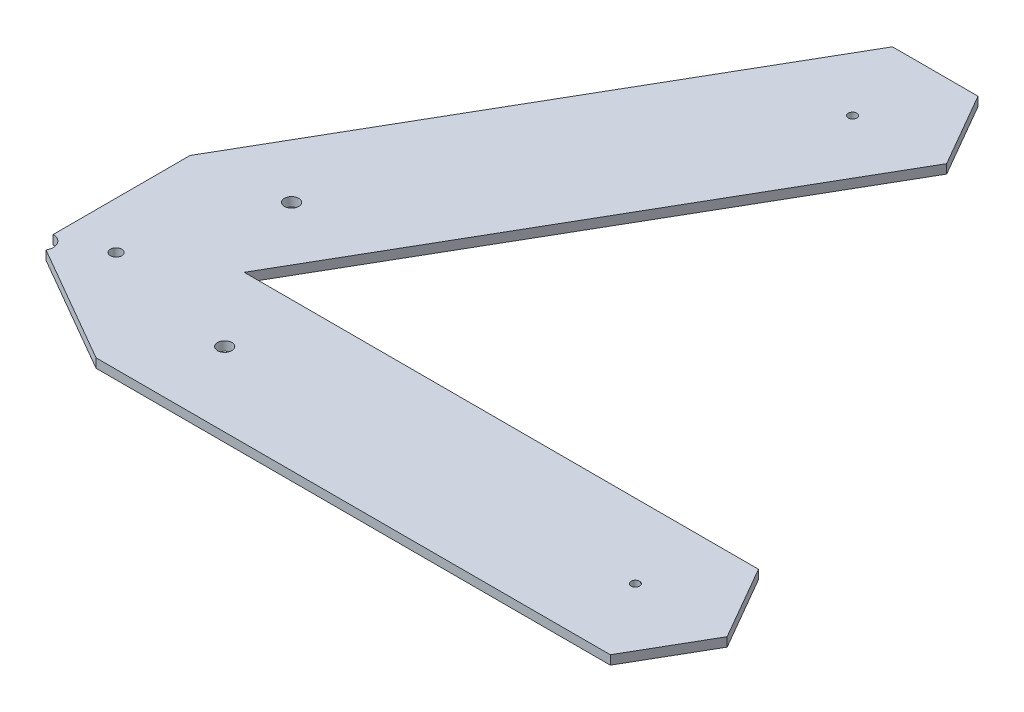
ISO-10303-21;
HEADER;
FILE_DESCRIPTION(('STEP AP214'),'2;1');
FILE_NAME('part.step','',(''),(''),'','','');
FILE_SCHEMA(('AUTOMOTIVE_DESIGN { 1 0 10303 214 1 1 1 1 }'));
ENDSEC;
DATA;
#1=APPLICATION_CONTEXT('core data for automotive mechanical design processes');
#2=APPLICATION_PROTOCOL_DEFINITION('international standard','automotive_design',2000,#1);
#3=PRODUCT_CONTEXT('',#1,'mechanical');
#4=PRODUCT('Part','Part','',(#3));
#5=PRODUCT_RELATED_PRODUCT_CATEGORY('part','',(#4));
#6=PRODUCT_DEFINITION_FORMATION('','',#4);
#7=PRODUCT_DEFINITION_CONTEXT('part definition',#1,'design');
#8=PRODUCT_DEFINITION('design','',#6,#7);
#9=PRODUCT_DEFINITION_SHAPE('','',#8);
#10=(LENGTH_UNIT() NAMED_UNIT(*) SI_UNIT(.MILLI.,.METRE.));
#11=(NAMED_UNIT(*) PLANE_ANGLE_UNIT() SI_UNIT($,.RADIAN.));
#12=(NAMED_UNIT(*) SI_UNIT($,.STERADIAN.) SOLID_ANGLE_UNIT());
#13=UNCERTAINTY_MEASURE_WITH_UNIT(LENGTH_MEASURE(1.E-05),#10,'distance_accuracy_value','');
#14=(GEOMETRIC_REPRESENTATION_CONTEXT(3) GLOBAL_UNCERTAINTY_ASSIGNED_CONTEXT((#13)) GLOBAL_UNIT_ASSIGNED_CONTEXT((#10,
#11,#12)) REPRESENTATION_CONTEXT('',''));
#15=CARTESIAN_POINT('',(0.,0.,0.));
#16=DIRECTION('',(0.,0.,1.));
#17=DIRECTION('',(1.,0.,0.));
#18=AXIS2_PLACEMENT_3D('',#15,#16,#17);
#19=CARTESIAN_POINT('',(0.,3.175,0.));
#20=DIRECTION('',(0.,-1.,0.));
#21=DIRECTION('',(0.,0.,-1.));
#22=AXIS2_PLACEMENT_3D('',#19,#20,#21);
#23=CYLINDRICAL_SURFACE('',#22,3.96875);
#24=CARTESIAN_POINT('',(0.,0.,0.));
#25=DIRECTION('',(0.,1.,0.));
#26=DIRECTION('',(0.,0.,1.));
#27=AXIS2_PLACEMENT_3D('',#24,#25,#26);
#28=CIRCLE('',#27,3.96875);
#29=CARTESIAN_POINT('',(3.43703832126949,0.,1.984375));
#30=VERTEX_POINT('',#29);
#31=CARTESIAN_POINT('',(0.,0.,-3.96875));
#32=VERTEX_POINT('',#31);
#33=EDGE_CURVE('E191',#30,#32,#28,.T.);
#34=ORIENTED_EDGE('',*,*,#33,.F.);
#35=DIRECTION('',(0.,1.,0.));
#36=VECTOR('',#35,1.);
#37=CARTESIAN_POINT('',(3.43703832126949,0.,1.984375));
#38=LINE('',#37,#36);
#39=CARTESIAN_POINT('',(3.43703832126949,3.175,1.984375));
#40=VERTEX_POINT('',#39);
#41=EDGE_CURVE('E50',#30,#40,#38,.T.);
#42=ORIENTED_EDGE('',*,*,#41,.T.);
#43=CARTESIAN_POINT('',(0.,3.175,0.));
#44=DIRECTION('',(0.,1.,0.));
#45=DIRECTION('',(0.,0.,1.));
#46=AXIS2_PLACEMENT_3D('',#43,#44,#45);
#47=CIRCLE('',#46,3.96875);
#48=CARTESIAN_POINT('',(0.,3.175,-3.96875));
#49=VERTEX_POINT('',#48);
#50=EDGE_CURVE('E151',#40,#49,#47,.T.);
#51=ORIENTED_EDGE('',*,*,#50,.T.);
#52=DIRECTION('',(0.,1.,0.));
#53=VECTOR('',#52,1.);
#54=CARTESIAN_POINT('',(0.,0.,-3.96875));
#55=LINE('',#54,#53);
#56=EDGE_CURVE('E167',#32,#49,#55,.T.);
#57=ORIENTED_EDGE('',*,*,#56,.F.);
#58=EDGE_LOOP('',(#34,#42,#51,#57));
#59=FACE_BOUND('',#58,.T.);
#60=ADVANCED_FACE('F35',(#59),#23,.F.);
#61=CARTESIAN_POINT('',(0.,3.175,0.));
#62=DIRECTION('',(0.,1.,0.));
#63=DIRECTION('',(0.,0.,1.));
#64=AXIS2_PLACEMENT_3D('',#61,#62,#63);
#65=PLANE('',#64);
#66=CARTESIAN_POINT('',(104.091105000002,3.175,-180.291082475986));
#67=DIRECTION('',(0.,1.,0.));
#68=DIRECTION('',(0.,0.,1.));
#69=AXIS2_PLACEMENT_3D('',#66,#67,#68);
#70=CIRCLE('',#69,1.49999999999998);
#71=CARTESIAN_POINT('',(104.091105000002,3.175,-178.791082475986));
#72=VERTEX_POINT('',#71);
#73=EDGE_CURVE('E160',#72,#72,#70,.T.);
#74=ORIENTED_EDGE('',*,*,#73,.F.);
#75=EDGE_LOOP('',(#74));
#76=FACE_BOUND('',#75,.T.);
#77=CARTESIAN_POINT('',(32.066865,3.175,-55.5414394194522));
#78=DIRECTION('',(0.,1.,0.));
#79=DIRECTION('',(0.,0.,1.));
#80=AXIS2_PLACEMENT_3D('',#77,#78,#79);
#81=CIRCLE('',#80,2.5);
#82=CARTESIAN_POINT('',(32.066865,3.175,-53.0414394194522));
#83=VERTEX_POINT('',#82);
#84=EDGE_CURVE('E157',#83,#83,#81,.T.);
#85=ORIENTED_EDGE('',*,*,#84,.F.);
#86=EDGE_LOOP('',(#85));
#87=FACE_BOUND('',#86,.T.);
#88=CARTESIAN_POINT('',(16.4977839420935,3.175,-9.52500000000003));
#89=DIRECTION('',(0.,1.,0.));
#90=DIRECTION('',(0.,0.,1.));
#91=AXIS2_PLACEMENT_3D('',#88,#89,#90);
#92=CIRCLE('',#91,2.);
#93=CARTESIAN_POINT('',(16.4977839420935,3.175,-7.52500000000002));
#94=VERTEX_POINT('',#93);
#95=EDGE_CURVE('E154',#94,#94,#92,.T.);
#96=ORIENTED_EDGE('',*,*,#95,.F.);
#97=EDGE_LOOP('',(#96));
#98=FACE_BOUND('',#97,.T.);
#99=CARTESIAN_POINT('',(208.18221,3.175,0.));
#100=DIRECTION('',(0.,1.,0.));
#101=DIRECTION('',(0.,0.,1.));
#102=AXIS2_PLACEMENT_3D('',#99,#100,#101);
#103=CIRCLE('',#102,1.5);
#104=CARTESIAN_POINT('',(208.18221,3.175,1.5));
#105=VERTEX_POINT('',#104);
#106=EDGE_CURVE('E148',#105,#105,#103,.T.);
#107=ORIENTED_EDGE('',*,*,#106,.F.);
#108=EDGE_LOOP('',(#107));
#109=FACE_BOUND('',#108,.T.);
#110=CARTESIAN_POINT('',(64.13373,3.175,0.));
#111=DIRECTION('',(0.,1.,0.));
#112=DIRECTION('',(0.,0.,1.));
#113=AXIS2_PLACEMENT_3D('',#110,#111,#112);
#114=CIRCLE('',#113,2.5);
#115=CARTESIAN_POINT('',(64.13373,3.175,2.49999999999997));
#116=VERTEX_POINT('',#115);
#117=EDGE_CURVE('E145',#116,#116,#114,.T.);
#118=ORIENTED_EDGE('',*,*,#117,.F.);
#119=EDGE_LOOP('',(#118));
#120=FACE_BOUND('',#119,.T.);
#121=ORIENTED_EDGE('',*,*,#50,.F.);
#122=DIRECTION('',(0.866025403784438,0.,0.500000000000001));
#123=VECTOR('',#122,1.);
#124=CARTESIAN_POINT('',(0.,3.175,0.));
#125=LINE('',#124,#123);
#126=CARTESIAN_POINT('',(44.9999999999999,3.175,25.9807621135331));
#127=VERTEX_POINT('',#126);
#128=EDGE_CURVE('E253',#40,#127,#125,.T.);
#129=ORIENTED_EDGE('',*,*,#128,.T.);
#130=DIRECTION('',(-1.,0.,0.));
#131=VECTOR('',#130,1.);
#132=CARTESIAN_POINT('',(0.,3.175,25.9807621135331));
#133=LINE('',#132,#131);
#134=CARTESIAN_POINT('',(225.38814,3.175,25.9807621135332));
#135=VERTEX_POINT('',#134);
#136=EDGE_CURVE('E203',#135,#127,#133,.T.);
#137=ORIENTED_EDGE('',*,*,#136,.F.);
#138=DIRECTION('',(-0.499999999999997,0.,0.866025403784441));
#139=VECTOR('',#138,1.);
#140=CARTESIAN_POINT('',(180.291105000001,3.175,104.091118004245));
#141=LINE('',#140,#139);
#142=CARTESIAN_POINT('',(240.38814,3.175,0.));
#143=VERTEX_POINT('',#142);
#144=EDGE_CURVE('E217',#143,#135,#141,.T.);
#145=ORIENTED_EDGE('',*,*,#144,.F.);
#146=DIRECTION('',(-0.499999999999996,0.,-0.866025403784441));
#147=VECTOR('',#146,1.);
#148=CARTESIAN_POINT('',(180.291105000001,3.175,-104.091118004245));
#149=LINE('',#148,#147);
#150=CARTESIAN_POINT('',(225.38814,3.175,-25.9807621135332));
#151=VERTEX_POINT('',#150);
#152=EDGE_CURVE('E227',#143,#151,#149,.T.);
#153=ORIENTED_EDGE('',*,*,#152,.T.);
#154=DIRECTION('',(1.,0.,0.));
#155=VECTOR('',#154,1.);
#156=CARTESIAN_POINT('',(0.,3.175,-25.9807621135332));
#157=LINE('',#156,#155);
#158=CARTESIAN_POINT('',(44.9999999999998,3.175,-25.9807621135332));
#159=VERTEX_POINT('',#158);
#160=EDGE_CURVE('E135',#159,#151,#157,.T.);
#161=ORIENTED_EDGE('',*,*,#160,.F.);
#162=DIRECTION('',(-0.500000000000014,0.,0.866025403784431));
#163=VECTOR('',#162,1.);
#164=CARTESIAN_POINT('',(22.4999999999991,3.175,12.9903810567665));
#165=LINE('',#164,#163);
#166=CARTESIAN_POINT('',(135.194070000002,3.175,-182.201473894956));
#167=VERTEX_POINT('',#166);
#168=EDGE_CURVE('E120',#167,#159,#165,.T.);
#169=ORIENTED_EDGE('',*,*,#168,.F.);
#170=DIRECTION('',(0.499999999999994,0.,0.866025403784442));
#171=VECTOR('',#170,1.);
#172=CARTESIAN_POINT('',(180.291105000001,3.175,-104.091118004244));
#173=LINE('',#172,#171);
#174=CARTESIAN_POINT('',(120.194070000002,3.175,-208.182236008489));
#175=VERTEX_POINT('',#174);
#176=EDGE_CURVE('E133',#175,#167,#173,.T.);
#177=ORIENTED_EDGE('',*,*,#176,.F.);
#178=DIRECTION('',(-1.,0.,0.));
#179=VECTOR('',#178,1.);
#180=CARTESIAN_POINT('',(3.081716156461E-12,3.175,-208.182236008491));
#181=LINE('',#180,#179);
#182=CARTESIAN_POINT('',(90.1940700000024,3.175,-208.182236008489));
#183=VERTEX_POINT('',#182);
#184=EDGE_CURVE('E59',#175,#183,#181,.T.);
#185=ORIENTED_EDGE('',*,*,#184,.T.);
#186=DIRECTION('',(0.50000000000001,0.,-0.866025403784433));
#187=VECTOR('',#186,1.);
#188=CARTESIAN_POINT('',(-22.4999999999999,3.175,-12.9903810567669));
#189=LINE('',#188,#187);
#190=CARTESIAN_POINT('',(-1.25800873561094E-13,3.175,-51.9615242270673));
#191=VERTEX_POINT('',#190);
#192=EDGE_CURVE('E139',#191,#183,#189,.T.);
#193=ORIENTED_EDGE('',*,*,#192,.F.);
#194=DIRECTION('',(0.,0.,-1.));
#195=VECTOR('',#194,1.);
#196=CARTESIAN_POINT('',(0.,3.175,0.));
#197=LINE('',#196,#195);
#198=EDGE_CURVE('E244',#49,#191,#197,.T.);
#199=ORIENTED_EDGE('',*,*,#198,.F.);
#200=EDGE_LOOP('',(#121,#129,#137,#145,#153,#161,#169,#177,#185,#193,#199));
#201=FACE_BOUND('',#200,.T.);
#202=ADVANCED_FACE('F132',(#76,#87,#98,#109,#120,#201),#65,.T.);
#203=CARTESIAN_POINT('',(0.,0.,0.));
#204=DIRECTION('',(0.,1.,0.));
#205=DIRECTION('',(0.,0.,1.));
#206=AXIS2_PLACEMENT_3D('',#203,#204,#205);
#207=PLANE('',#206);
#208=CARTESIAN_POINT('',(104.091105000002,0.,-180.291082475986));
#209=DIRECTION('',(0.,1.,0.));
#210=DIRECTION('',(0.,0.,1.));
#211=AXIS2_PLACEMENT_3D('',#208,#209,#210);
#212=CIRCLE('',#211,1.49999999999998);
#213=CARTESIAN_POINT('',(104.091105000002,0.,-178.791082475986));
#214=VERTEX_POINT('',#213);
#215=EDGE_CURVE('E200',#214,#214,#212,.T.);
#216=ORIENTED_EDGE('',*,*,#215,.T.);
#217=EDGE_LOOP('',(#216));
#218=FACE_BOUND('',#217,.T.);
#219=CARTESIAN_POINT('',(32.066865,0.,-55.5414394194522));
#220=DIRECTION('',(0.,1.,0.));
#221=DIRECTION('',(0.,0.,1.));
#222=AXIS2_PLACEMENT_3D('',#219,#220,#221);
#223=CIRCLE('',#222,2.5);
#224=CARTESIAN_POINT('',(32.066865,0.,-53.0414394194522));
#225=VERTEX_POINT('',#224);
#226=EDGE_CURVE('E197',#225,#225,#223,.T.);
#227=ORIENTED_EDGE('',*,*,#226,.T.);
#228=EDGE_LOOP('',(#227));
#229=FACE_BOUND('',#228,.T.);
#230=CARTESIAN_POINT('',(16.4977839420935,0.,-9.52500000000003));
#231=DIRECTION('',(0.,1.,0.));
#232=DIRECTION('',(0.,0.,1.));
#233=AXIS2_PLACEMENT_3D('',#230,#231,#232);
#234=CIRCLE('',#233,2.);
#235=CARTESIAN_POINT('',(16.4977839420935,0.,-7.52500000000002));
#236=VERTEX_POINT('',#235);
#237=EDGE_CURVE('E194',#236,#236,#234,.T.);
#238=ORIENTED_EDGE('',*,*,#237,.T.);
#239=EDGE_LOOP('',(#238));
#240=FACE_BOUND('',#239,.T.);
#241=CARTESIAN_POINT('',(208.18221,0.,0.));
#242=DIRECTION('',(0.,1.,0.));
#243=DIRECTION('',(0.,0.,1.));
#244=AXIS2_PLACEMENT_3D('',#241,#242,#243);
#245=CIRCLE('',#244,1.5);
#246=CARTESIAN_POINT('',(208.18221,0.,1.5));
#247=VERTEX_POINT('',#246);
#248=EDGE_CURVE('E188',#247,#247,#245,.T.);
#249=ORIENTED_EDGE('',*,*,#248,.T.);
#250=EDGE_LOOP('',(#249));
#251=FACE_BOUND('',#250,.T.);
#252=CARTESIAN_POINT('',(64.13373,0.,0.));
#253=DIRECTION('',(0.,1.,0.));
#254=DIRECTION('',(0.,0.,1.));
#255=AXIS2_PLACEMENT_3D('',#252,#253,#254);
#256=CIRCLE('',#255,2.5);
#257=CARTESIAN_POINT('',(64.13373,0.,2.49999999999997));
#258=VERTEX_POINT('',#257);
#259=EDGE_CURVE('E185',#258,#258,#256,.T.);
#260=ORIENTED_EDGE('',*,*,#259,.T.);
#261=EDGE_LOOP('',(#260));
#262=FACE_BOUND('',#261,.T.);
#263=DIRECTION('',(0.866025403784438,0.,0.500000000000001));
#264=VECTOR('',#263,1.);
#265=CARTESIAN_POINT('',(0.,0.,0.));
#266=LINE('',#265,#264);
#267=CARTESIAN_POINT('',(44.9999999999999,0.,25.9807621135332));
#268=VERTEX_POINT('',#267);
#269=EDGE_CURVE('E261',#30,#268,#266,.T.);
#270=ORIENTED_EDGE('',*,*,#269,.F.);
#271=ORIENTED_EDGE('',*,*,#33,.T.);
#272=DIRECTION('',(0.,0.,-1.));
#273=VECTOR('',#272,1.);
#274=CARTESIAN_POINT('',(0.,0.,0.));
#275=LINE('',#274,#273);
#276=CARTESIAN_POINT('',(5.13478148889135E-13,0.,-51.9615242270662));
#277=VERTEX_POINT('',#276);
#278=EDGE_CURVE('E259',#32,#277,#275,.T.);
#279=ORIENTED_EDGE('',*,*,#278,.T.);
#280=DIRECTION('',(0.50000000000001,0.,-0.866025403784433));
#281=VECTOR('',#280,1.);
#282=CARTESIAN_POINT('',(-22.4999999999999,0.,-12.9903810567669));
#283=LINE('',#282,#281);
#284=CARTESIAN_POINT('',(90.1940700000024,0.,-208.182236008489));
#285=VERTEX_POINT('',#284);
#286=EDGE_CURVE('E182',#277,#285,#283,.T.);
#287=ORIENTED_EDGE('',*,*,#286,.T.);
#288=DIRECTION('',(-1.,0.,0.));
#289=VECTOR('',#288,1.);
#290=CARTESIAN_POINT('',(3.081716156461E-12,0.,-208.182236008491));
#291=LINE('',#290,#289);
#292=CARTESIAN_POINT('',(120.194070000002,0.,-208.182236008489));
#293=VERTEX_POINT('',#292);
#294=EDGE_CURVE('E179',#293,#285,#291,.T.);
#295=ORIENTED_EDGE('',*,*,#294,.F.);
#296=DIRECTION('',(0.499999999999994,0.,0.866025403784442));
#297=VECTOR('',#296,1.);
#298=CARTESIAN_POINT('',(180.291105000001,0.,-104.091118004244));
#299=LINE('',#298,#297);
#300=CARTESIAN_POINT('',(135.194070000002,0.,-182.201473894956));
#301=VERTEX_POINT('',#300);
#302=EDGE_CURVE('E177',#293,#301,#299,.T.);
#303=ORIENTED_EDGE('',*,*,#302,.T.);
#304=DIRECTION('',(-0.500000000000014,0.,0.866025403784431));
#305=VECTOR('',#304,1.);
#306=CARTESIAN_POINT('',(22.4999999999991,0.,12.9903810567665));
#307=LINE('',#306,#305);
#308=CARTESIAN_POINT('',(44.9999999999998,0.,-25.9807621135332));
#309=VERTEX_POINT('',#308);
#310=EDGE_CURVE('E122',#301,#309,#307,.T.);
#311=ORIENTED_EDGE('',*,*,#310,.T.);
#312=DIRECTION('',(1.,0.,0.));
#313=VECTOR('',#312,1.);
#314=CARTESIAN_POINT('',(0.,0.,-25.9807621135332));
#315=LINE('',#314,#313);
#316=CARTESIAN_POINT('',(225.38814,0.,-25.9807621135332));
#317=VERTEX_POINT('',#316);
#318=EDGE_CURVE('E173',#309,#317,#315,.T.);
#319=ORIENTED_EDGE('',*,*,#318,.T.);
#320=DIRECTION('',(-0.499999999999996,0.,-0.866025403784441));
#321=VECTOR('',#320,1.);
#322=CARTESIAN_POINT('',(180.291105000001,0.,-104.091118004245));
#323=LINE('',#322,#321);
#324=CARTESIAN_POINT('',(240.38814,0.,0.));
#325=VERTEX_POINT('',#324);
#326=EDGE_CURVE('E170',#325,#317,#323,.T.);
#327=ORIENTED_EDGE('',*,*,#326,.F.);
#328=DIRECTION('',(-0.499999999999997,0.,0.866025403784441));
#329=VECTOR('',#328,1.);
#330=CARTESIAN_POINT('',(180.291105000001,0.,104.091118004245));
#331=LINE('',#330,#329);
#332=CARTESIAN_POINT('',(225.38814,0.,25.9807621135332));
#333=VERTEX_POINT('',#332);
#334=EDGE_CURVE('E166',#325,#333,#331,.T.);
#335=ORIENTED_EDGE('',*,*,#334,.T.);
#336=DIRECTION('',(-1.,0.,0.));
#337=VECTOR('',#336,1.);
#338=CARTESIAN_POINT('',(0.,0.,25.9807621135331));
#339=LINE('',#338,#337);
#340=EDGE_CURVE('E163',#333,#268,#339,.T.);
#341=ORIENTED_EDGE('',*,*,#340,.T.);
#342=EDGE_LOOP('',(#270,#271,#279,#287,#295,#303,#311,#319,#327,#335,#341));
#343=FACE_BOUND('',#342,.T.);
#344=ADVANCED_FACE('F221',(#218,#229,#240,#251,#262,#343),#207,.F.);
#345=CARTESIAN_POINT('',(0.,3.175,25.9807621135331));
#346=DIRECTION('',(0.,0.,1.));
#347=DIRECTION('',(1.,0.,0.));
#348=AXIS2_PLACEMENT_3D('',#345,#346,#347);
#349=PLANE('',#348);
#350=ORIENTED_EDGE('',*,*,#340,.F.);
#351=DIRECTION('',(0.,-1.,0.));
#352=VECTOR('',#351,1.);
#353=CARTESIAN_POINT('',(225.38814,3.175,25.9807621135332));
#354=LINE('',#353,#352);
#355=EDGE_CURVE('E43',#135,#333,#354,.T.);
#356=ORIENTED_EDGE('',*,*,#355,.F.);
#357=ORIENTED_EDGE('',*,*,#136,.T.);
#358=DIRECTION('',(0.,-1.,0.));
#359=VECTOR('',#358,1.);
#360=CARTESIAN_POINT('',(44.9999999999999,3.175,25.9807621135331));
#361=LINE('',#360,#359);
#362=EDGE_CURVE('E11',#127,#268,#361,.T.);
#363=ORIENTED_EDGE('',*,*,#362,.T.);
#364=EDGE_LOOP('',(#350,#356,#357,#363));
#365=FACE_BOUND('',#364,.T.);
#366=ADVANCED_FACE('F37',(#365),#349,.T.);
#367=CARTESIAN_POINT('',(180.291105000001,3.175,104.091118004245));
#368=DIRECTION('',(0.86602540378444,0.,0.499999999999997));
#369=DIRECTION('',(0.499999999999997,0.,-0.866025403784441));
#370=AXIS2_PLACEMENT_3D('',#367,#368,#369);
#371=PLANE('',#370);
#372=ORIENTED_EDGE('',*,*,#334,.F.);
#373=DIRECTION('',(0.,-1.,0.));
#374=VECTOR('',#373,1.);
#375=CARTESIAN_POINT('',(240.38814,3.175,0.));
#376=LINE('',#375,#374);
#377=EDGE_CURVE('E211',#143,#325,#376,.T.);
#378=ORIENTED_EDGE('',*,*,#377,.F.);
#379=ORIENTED_EDGE('',*,*,#144,.T.);
#380=ORIENTED_EDGE('',*,*,#355,.T.);
#381=EDGE_LOOP('',(#372,#378,#379,#380));
#382=FACE_BOUND('',#381,.T.);
#383=ADVANCED_FACE('F215',(#382),#371,.T.);
#384=CARTESIAN_POINT('',(180.291105000001,3.175,-104.091118004245));
#385=DIRECTION('',(-0.866025403784441,0.,0.499999999999996));
#386=DIRECTION('',(0.499999999999996,0.,0.866025403784441));
#387=AXIS2_PLACEMENT_3D('',#384,#385,#386);
#388=PLANE('',#387);
#389=ORIENTED_EDGE('',*,*,#326,.T.);
#390=DIRECTION('',(0.,-1.,0.));
#391=VECTOR('',#390,1.);
#392=CARTESIAN_POINT('',(225.38814,3.175,-25.9807621135332));
#393=LINE('',#392,#391);
#394=EDGE_CURVE('E209',#151,#317,#393,.T.);
#395=ORIENTED_EDGE('',*,*,#394,.F.);
#396=ORIENTED_EDGE('',*,*,#152,.F.);
#397=ORIENTED_EDGE('',*,*,#377,.T.);
#398=EDGE_LOOP('',(#389,#395,#396,#397));
#399=FACE_BOUND('',#398,.T.);
#400=ADVANCED_FACE('F225',(#399),#388,.F.);
#401=CARTESIAN_POINT('',(0.,3.175,-25.9807621135332));
#402=DIRECTION('',(0.,0.,-1.));
#403=DIRECTION('',(-1.,0.,0.));
#404=AXIS2_PLACEMENT_3D('',#401,#402,#403);
#405=PLANE('',#404);
#406=ORIENTED_EDGE('',*,*,#318,.F.);
#407=DIRECTION('',(0.,-1.,0.));
#408=VECTOR('',#407,1.);
#409=CARTESIAN_POINT('',(44.9999999999998,3.175,-25.9807621135332));
#410=LINE('',#409,#408);
#411=EDGE_CURVE('E127',#159,#309,#410,.T.);
#412=ORIENTED_EDGE('',*,*,#411,.F.);
#413=ORIENTED_EDGE('',*,*,#160,.T.);
#414=ORIENTED_EDGE('',*,*,#394,.T.);
#415=EDGE_LOOP('',(#406,#412,#413,#414));
#416=FACE_BOUND('',#415,.T.);
#417=ADVANCED_FACE('F234',(#416),#405,.T.);
#418=CARTESIAN_POINT('',(22.4999999999991,3.175,12.9903810567665));
#419=DIRECTION('',(0.866025403784431,0.,0.500000000000013));
#420=DIRECTION('',(0.500000000000014,0.,-0.866025403784431));
#421=AXIS2_PLACEMENT_3D('',#418,#419,#420);
#422=PLANE('',#421);
#423=ORIENTED_EDGE('',*,*,#310,.F.);
#424=DIRECTION('',(0.,-1.,0.));
#425=VECTOR('',#424,1.);
#426=CARTESIAN_POINT('',(135.194070000002,3.175,-182.201473894956));
#427=LINE('',#426,#425);
#428=EDGE_CURVE('E117',#167,#301,#427,.T.);
#429=ORIENTED_EDGE('',*,*,#428,.F.);
#430=ORIENTED_EDGE('',*,*,#168,.T.);
#431=ORIENTED_EDGE('',*,*,#411,.T.);
#432=EDGE_LOOP('',(#423,#429,#430,#431));
#433=FACE_BOUND('',#432,.T.);
#434=ADVANCED_FACE('F119',(#433),#422,.T.);
#435=CARTESIAN_POINT('',(180.291105000001,3.175,-104.091118004244));
#436=DIRECTION('',(0.866025403784442,0.,-0.499999999999994));
#437=DIRECTION('',(-0.499999999999995,0.,-0.866025403784442));
#438=AXIS2_PLACEMENT_3D('',#435,#436,#437);
#439=PLANE('',#438);
#440=ORIENTED_EDGE('',*,*,#302,.F.);
#441=DIRECTION('',(0.,-1.,0.));
#442=VECTOR('',#441,1.);
#443=CARTESIAN_POINT('',(120.194070000002,3.175,-208.182236008489));
#444=LINE('',#443,#442);
#445=EDGE_CURVE('E128',#175,#293,#444,.T.);
#446=ORIENTED_EDGE('',*,*,#445,.F.);
#447=ORIENTED_EDGE('',*,*,#176,.T.);
#448=ORIENTED_EDGE('',*,*,#428,.T.);
#449=EDGE_LOOP('',(#440,#446,#447,#448));
#450=FACE_BOUND('',#449,.T.);
#451=ADVANCED_FACE('F137',(#450),#439,.T.);
#452=CARTESIAN_POINT('',(3.081716156461E-12,3.175,-208.182236008491));
#453=DIRECTION('',(0.,0.,1.));
#454=DIRECTION('',(1.,0.,0.));
#455=AXIS2_PLACEMENT_3D('',#452,#453,#454);
#456=PLANE('',#455);
#457=ORIENTED_EDGE('',*,*,#294,.T.);
#458=DIRECTION('',(0.,-1.,0.));
#459=VECTOR('',#458,1.);
#460=CARTESIAN_POINT('',(90.1940700000024,3.175,-208.182236008489));
#461=LINE('',#460,#459);
#462=EDGE_CURVE('E205',#183,#285,#461,.T.);
#463=ORIENTED_EDGE('',*,*,#462,.F.);
#464=ORIENTED_EDGE('',*,*,#184,.F.);
#465=ORIENTED_EDGE('',*,*,#445,.T.);
#466=EDGE_LOOP('',(#457,#463,#464,#465));
#467=FACE_BOUND('',#466,.T.);
#468=ADVANCED_FACE('F238',(#467),#456,.F.);
#469=CARTESIAN_POINT('',(-22.4999999999999,3.175,-12.9903810567669));
#470=DIRECTION('',(-0.866025403784433,0.,-0.50000000000001));
#471=DIRECTION('',(-0.50000000000001,0.,0.866025403784433));
#472=AXIS2_PLACEMENT_3D('',#469,#470,#471);
#473=PLANE('',#472);
#474=ORIENTED_EDGE('',*,*,#286,.F.);
#475=DIRECTION('',(0.,-1.,0.));
#476=VECTOR('',#475,1.);
#477=CARTESIAN_POINT('',(5.13478148889135E-13,3.175,-51.9615242270662));
#478=LINE('',#477,#476);
#479=EDGE_CURVE('E94',#191,#277,#478,.T.);
#480=ORIENTED_EDGE('',*,*,#479,.F.);
#481=ORIENTED_EDGE('',*,*,#192,.T.);
#482=ORIENTED_EDGE('',*,*,#462,.T.);
#483=EDGE_LOOP('',(#474,#480,#481,#482));
#484=FACE_BOUND('',#483,.T.);
#485=ADVANCED_FACE('F240',(#484),#473,.T.);
#486=CARTESIAN_POINT('',(104.091105000002,3.175,-180.291082475986));
#487=DIRECTION('',(0.,-1.,0.));
#488=DIRECTION('',(0.,0.,-1.));
#489=AXIS2_PLACEMENT_3D('',#486,#487,#488);
#490=CYLINDRICAL_SURFACE('',#489,1.49999999999998);
#491=ORIENTED_EDGE('',*,*,#73,.T.);
#492=EDGE_LOOP('',(#491));
#493=FACE_BOUND('',#492,.T.);
#494=ORIENTED_EDGE('',*,*,#215,.F.);
#495=EDGE_LOOP('',(#494));
#496=FACE_BOUND('',#495,.T.);
#497=ADVANCED_FACE('F293',(#493,#496),#490,.F.);
#498=CARTESIAN_POINT('',(32.066865,3.175,-55.5414394194522));
#499=DIRECTION('',(0.,-1.,0.));
#500=DIRECTION('',(0.,0.,-1.));
#501=AXIS2_PLACEMENT_3D('',#498,#499,#500);
#502=CYLINDRICAL_SURFACE('',#501,2.5);
#503=ORIENTED_EDGE('',*,*,#84,.T.);
#504=EDGE_LOOP('',(#503));
#505=FACE_BOUND('',#504,.T.);
#506=ORIENTED_EDGE('',*,*,#226,.F.);
#507=EDGE_LOOP('',(#506));
#508=FACE_BOUND('',#507,.T.);
#509=ADVANCED_FACE('F317',(#505,#508),#502,.F.);
#510=CARTESIAN_POINT('',(16.4977839420935,3.175,-9.52500000000003));
#511=DIRECTION('',(0.,-1.,0.));
#512=DIRECTION('',(0.,0.,-1.));
#513=AXIS2_PLACEMENT_3D('',#510,#511,#512);
#514=CYLINDRICAL_SURFACE('',#513,2.);
#515=ORIENTED_EDGE('',*,*,#95,.T.);
#516=EDGE_LOOP('',(#515));
#517=FACE_BOUND('',#516,.T.);
#518=ORIENTED_EDGE('',*,*,#237,.F.);
#519=EDGE_LOOP('',(#518));
#520=FACE_BOUND('',#519,.T.);
#521=ADVANCED_FACE('F286',(#517,#520),#514,.F.);
#522=CARTESIAN_POINT('',(208.18221,3.175,0.));
#523=DIRECTION('',(0.,-1.,0.));
#524=DIRECTION('',(0.,0.,-1.));
#525=AXIS2_PLACEMENT_3D('',#522,#523,#524);
#526=CYLINDRICAL_SURFACE('',#525,1.5);
#527=ORIENTED_EDGE('',*,*,#106,.T.);
#528=EDGE_LOOP('',(#527));
#529=FACE_BOUND('',#528,.T.);
#530=ORIENTED_EDGE('',*,*,#248,.F.);
#531=EDGE_LOOP('',(#530));
#532=FACE_BOUND('',#531,.T.);
#533=ADVANCED_FACE('F274',(#529,#532),#526,.F.);
#534=CARTESIAN_POINT('',(64.13373,3.175,0.));
#535=DIRECTION('',(0.,-1.,0.));
#536=DIRECTION('',(0.,0.,-1.));
#537=AXIS2_PLACEMENT_3D('',#534,#535,#536);
#538=CYLINDRICAL_SURFACE('',#537,2.5);
#539=ORIENTED_EDGE('',*,*,#117,.T.);
#540=EDGE_LOOP('',(#539));
#541=FACE_BOUND('',#540,.T.);
#542=ORIENTED_EDGE('',*,*,#259,.F.);
#543=EDGE_LOOP('',(#542));
#544=FACE_BOUND('',#543,.T.);
#545=ADVANCED_FACE('F267',(#541,#544),#538,.F.);
#546=CARTESIAN_POINT('',(0.,0.,0.));
#547=DIRECTION('',(1.,0.,0.));
#548=DIRECTION('',(0.,0.,-1.));
#549=AXIS2_PLACEMENT_3D('',#546,#547,#548);
#550=PLANE('',#549);
#551=ORIENTED_EDGE('',*,*,#479,.T.);
#552=ORIENTED_EDGE('',*,*,#278,.F.);
#553=ORIENTED_EDGE('',*,*,#56,.T.);
#554=ORIENTED_EDGE('',*,*,#198,.T.);
#555=EDGE_LOOP('',(#551,#552,#553,#554));
#556=FACE_BOUND('',#555,.T.);
#557=ADVANCED_FACE('F265',(#556),#550,.F.);
#558=CARTESIAN_POINT('',(0.,0.,0.));
#559=DIRECTION('',(-0.500000000000001,0.,0.866025403784438));
#560=DIRECTION('',(0.866025403784438,0.,0.500000000000001));
#561=AXIS2_PLACEMENT_3D('',#558,#559,#560);
#562=PLANE('',#561);
#563=ORIENTED_EDGE('',*,*,#128,.F.);
#564=ORIENTED_EDGE('',*,*,#41,.F.);
#565=ORIENTED_EDGE('',*,*,#269,.T.);
#566=ORIENTED_EDGE('',*,*,#362,.F.);
#567=EDGE_LOOP('',(#563,#564,#565,#566));
#568=FACE_BOUND('',#567,.T.);
#569=ADVANCED_FACE('F254',(#568),#562,.T.);
#570=CLOSED_SHELL('',(#60,#202,#344,#366,#383,#400,#417,#434,#451,#468,#485,#497,#509,#521,#533,
#545,#557,#569));
#571=MANIFOLD_SOLID_BREP('B2',#570);
#572=ADVANCED_BREP_SHAPE_REPRESENTATION('',(#18,#571),#14);
#573=SHAPE_DEFINITION_REPRESENTATION(#9,#572);
ENDSEC;
END-ISO-10303-21;
